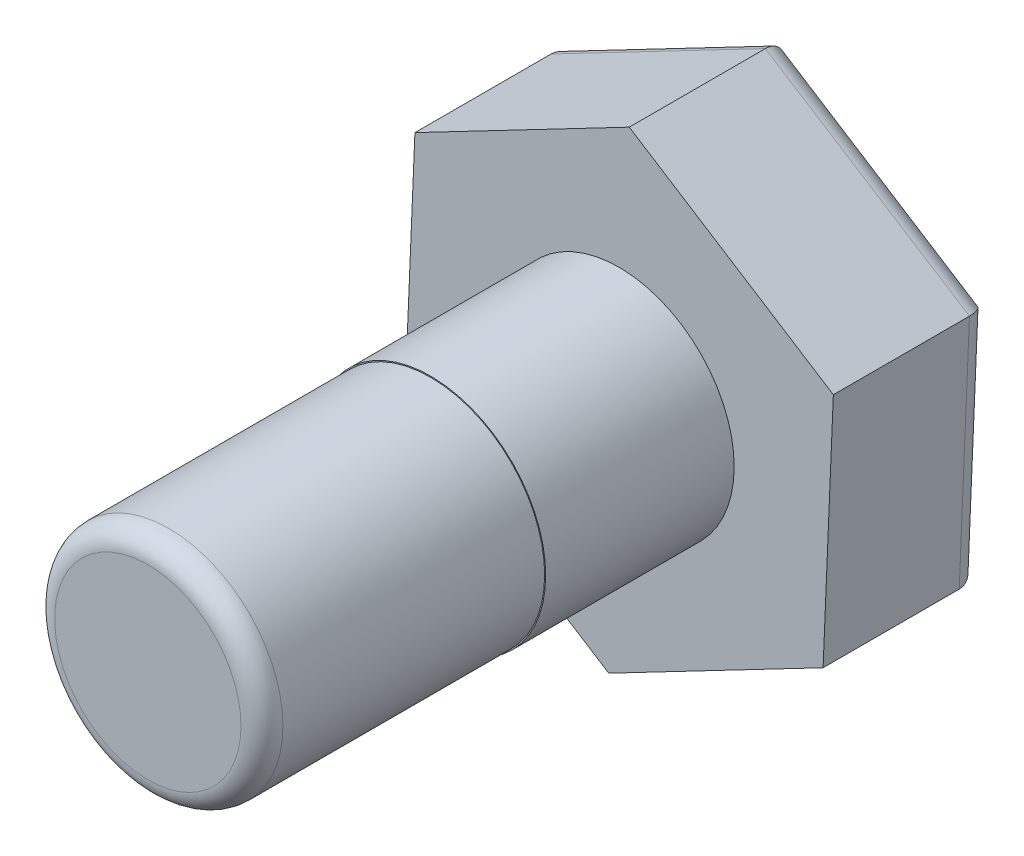
ISO-10303-21;
HEADER;
FILE_DESCRIPTION(('STEP AP214'),'2;1');
FILE_NAME('part.step','',(''),(''),'','','');
FILE_SCHEMA(('AUTOMOTIVE_DESIGN { 1 0 10303 214 1 1 1 1 }'));
ENDSEC;
DATA;
#1=APPLICATION_CONTEXT('core data for automotive mechanical design processes');
#2=APPLICATION_PROTOCOL_DEFINITION('international standard','automotive_design',2000,#1);
#3=PRODUCT_CONTEXT('',#1,'mechanical');
#4=PRODUCT('Part','Part','',(#3));
#5=PRODUCT_RELATED_PRODUCT_CATEGORY('part','',(#4));
#6=PRODUCT_DEFINITION_FORMATION('','',#4);
#7=PRODUCT_DEFINITION_CONTEXT('part definition',#1,'design');
#8=PRODUCT_DEFINITION('design','',#6,#7);
#9=PRODUCT_DEFINITION_SHAPE('','',#8);
#10=(LENGTH_UNIT() NAMED_UNIT(*) SI_UNIT(.MILLI.,.METRE.));
#11=(NAMED_UNIT(*) PLANE_ANGLE_UNIT() SI_UNIT($,.RADIAN.));
#12=(NAMED_UNIT(*) SI_UNIT($,.STERADIAN.) SOLID_ANGLE_UNIT());
#13=UNCERTAINTY_MEASURE_WITH_UNIT(LENGTH_MEASURE(1.E-05),#10,'distance_accuracy_value','');
#14=(GEOMETRIC_REPRESENTATION_CONTEXT(3) GLOBAL_UNCERTAINTY_ASSIGNED_CONTEXT((#13)) GLOBAL_UNIT_ASSIGNED_CONTEXT((#10,
#11,#12)) REPRESENTATION_CONTEXT('',''));
#15=CARTESIAN_POINT('',(0.,0.,0.));
#16=DIRECTION('',(0.,0.,1.));
#17=DIRECTION('',(1.,0.,0.));
#18=AXIS2_PLACEMENT_3D('',#15,#16,#17);
#19=CARTESIAN_POINT('',(0.,0.,33.));
#20=DIRECTION('',(0.,0.,1.));
#21=DIRECTION('',(1.,0.,0.));
#22=AXIS2_PLACEMENT_3D('',#19,#20,#21);
#23=PLANE('',#22);
#24=CARTESIAN_POINT('',(0.,0.,33.));
#25=DIRECTION('',(0.,0.,1.));
#26=DIRECTION('',(1.,0.,0.));
#27=AXIS2_PLACEMENT_3D('',#24,#25,#26);
#28=CIRCLE('',#27,11.);
#29=CARTESIAN_POINT('',(11.,0.,33.));
#30=VERTEX_POINT('',#29);
#31=EDGE_CURVE('E130',#30,#30,#28,.T.);
#32=ORIENTED_EDGE('',*,*,#31,.T.);
#33=EDGE_LOOP('',(#32));
#34=FACE_BOUND('',#33,.T.);
#35=CARTESIAN_POINT('',(0.,0.,33.));
#36=DIRECTION('',(0.,0.,1.));
#37=DIRECTION('',(1.,0.,0.));
#38=AXIS2_PLACEMENT_3D('',#35,#36,#37);
#39=CIRCLE('',#38,10.9);
#40=CARTESIAN_POINT('',(10.9,0.,33.));
#41=VERTEX_POINT('',#40);
#42=EDGE_CURVE('E165',#41,#41,#39,.T.);
#43=ORIENTED_EDGE('',*,*,#42,.F.);
#44=EDGE_LOOP('',(#43));
#45=FACE_BOUND('',#44,.T.);
#46=ADVANCED_FACE('F37',(#34,#45),#23,.T.);
#47=CARTESIAN_POINT('',(19.4915119627059,-12.3860524276714,15.));
#48=DIRECTION('',(-0.999097599975706,0.0424733530908878,0.));
#49=DIRECTION('',(-0.0424733530908878,-0.999097599975706,0.));
#50=AXIS2_PLACEMENT_3D('',#47,#48,#49);
#51=PLANE('',#50);
#52=DIRECTION('',(0.,0.,-1.));
#53=VECTOR('',#52,1.);
#54=CARTESIAN_POINT('',(19.4915119627059,-12.3860524276714,15.));
#55=LINE('',#54,#53);
#56=CARTESIAN_POINT('',(19.4915119627059,-12.3860524276714,15.));
#57=VERTEX_POINT('',#56);
#58=CARTESIAN_POINT('',(19.4915119627059,-12.3860524276714,2.));
#59=VERTEX_POINT('',#58);
#60=EDGE_CURVE('E278',#57,#59,#55,.T.);
#61=ORIENTED_EDGE('',*,*,#60,.T.);
#62=DIRECTION('',(0.0424733530908878,0.999097599975706,0.));
#63=VECTOR('',#62,1.);
#64=CARTESIAN_POINT('',(19.4915119627059,-12.3860524276714,2.));
#65=LINE('',#64,#63);
#66=CARTESIAN_POINT('',(20.4723920363223,10.6871183040359,2.));
#67=VERTEX_POINT('',#66);
#68=EDGE_CURVE('E134',#59,#67,#65,.T.);
#69=ORIENTED_EDGE('',*,*,#68,.T.);
#70=DIRECTION('',(0.,0.,-1.));
#71=VECTOR('',#70,1.);
#72=CARTESIAN_POINT('',(20.4723920363223,10.6871183040359,15.));
#73=LINE('',#72,#71);
#74=CARTESIAN_POINT('',(20.4723920363223,10.6871183040359,15.));
#75=VERTEX_POINT('',#74);
#76=EDGE_CURVE('E116',#75,#67,#73,.T.);
#77=ORIENTED_EDGE('',*,*,#76,.F.);
#78=DIRECTION('',(0.0424733530908878,0.999097599975707,0.));
#79=VECTOR('',#78,1.);
#80=CARTESIAN_POINT('',(19.4915119627059,-12.3860524276714,15.));
#81=LINE('',#80,#79);
#82=EDGE_CURVE('E123',#57,#75,#81,.T.);
#83=ORIENTED_EDGE('',*,*,#82,.F.);
#84=EDGE_LOOP('',(#61,#69,#77,#83));
#85=FACE_BOUND('',#84,.T.);
#86=ADVANCED_FACE('F132',(#85),#51,.F.);
#87=CARTESIAN_POINT('',(20.4723920363223,10.6871183040359,15.));
#88=DIRECTION('',(-0.536331802748468,-0.844007225893581,0.));
#89=DIRECTION('',(0.844007225893581,-0.536331802748468,0.));
#90=AXIS2_PLACEMENT_3D('',#87,#88,#89);
#91=PLANE('',#90);
#92=ORIENTED_EDGE('',*,*,#76,.T.);
#93=DIRECTION('',(-0.844007225893581,0.536331802748468,0.));
#94=VECTOR('',#93,1.);
#95=CARTESIAN_POINT('',(20.4723920363223,10.6871183040359,2.));
#96=LINE('',#95,#94);
#97=CARTESIAN_POINT('',(0.980880073616411,23.0731707317073,2.));
#98=VERTEX_POINT('',#97);
#99=EDGE_CURVE('E135',#67,#98,#96,.T.);
#100=ORIENTED_EDGE('',*,*,#99,.T.);
#101=DIRECTION('',(0.,0.,-1.));
#102=VECTOR('',#101,1.);
#103=CARTESIAN_POINT('',(0.980880073616411,23.0731707317073,15.));
#104=LINE('',#103,#102);
#105=CARTESIAN_POINT('',(0.980880073616411,23.0731707317073,15.));
#106=VERTEX_POINT('',#105);
#107=EDGE_CURVE('E119',#106,#98,#104,.T.);
#108=ORIENTED_EDGE('',*,*,#107,.F.);
#109=DIRECTION('',(-0.844007225893581,0.536331802748468,0.));
#110=VECTOR('',#109,1.);
#111=CARTESIAN_POINT('',(20.4723920363223,10.6871183040359,15.));
#112=LINE('',#111,#110);
#113=EDGE_CURVE('E111',#75,#106,#112,.T.);
#114=ORIENTED_EDGE('',*,*,#113,.F.);
#115=EDGE_LOOP('',(#92,#100,#108,#114));
#116=FACE_BOUND('',#115,.T.);
#117=ADVANCED_FACE('F113',(#116),#91,.F.);
#118=CARTESIAN_POINT('',(0.980880073616411,23.0731707317073,15.));
#119=DIRECTION('',(0.462765797227238,-0.886480578984469,0.));
#120=DIRECTION('',(0.886480578984469,0.462765797227238,0.));
#121=AXIS2_PLACEMENT_3D('',#118,#119,#120);
#122=PLANE('',#121);
#123=ORIENTED_EDGE('',*,*,#107,.T.);
#124=DIRECTION('',(-0.886480578984469,-0.462765797227238,0.));
#125=VECTOR('',#124,1.);
#126=CARTESIAN_POINT('',(0.980880073616411,23.0731707317073,2.));
#127=LINE('',#126,#125);
#128=CARTESIAN_POINT('',(-19.4915119627059,12.3860524276714,2.));
#129=VERTEX_POINT('',#128);
#130=EDGE_CURVE('E155',#98,#129,#127,.T.);
#131=ORIENTED_EDGE('',*,*,#130,.T.);
#132=DIRECTION('',(0.,0.,-1.));
#133=VECTOR('',#132,1.);
#134=CARTESIAN_POINT('',(-19.4915119627059,12.3860524276714,15.));
#135=LINE('',#134,#133);
#136=CARTESIAN_POINT('',(-19.4915119627059,12.3860524276714,15.));
#137=VERTEX_POINT('',#136);
#138=EDGE_CURVE('E139',#137,#129,#135,.T.);
#139=ORIENTED_EDGE('',*,*,#138,.F.);
#140=DIRECTION('',(-0.886480578984469,-0.462765797227238,0.));
#141=VECTOR('',#140,1.);
#142=CARTESIAN_POINT('',(0.980880073616411,23.0731707317073,15.));
#143=LINE('',#142,#141);
#144=EDGE_CURVE('E122',#106,#137,#143,.T.);
#145=ORIENTED_EDGE('',*,*,#144,.F.);
#146=EDGE_LOOP('',(#123,#131,#139,#145));
#147=FACE_BOUND('',#146,.T.);
#148=ADVANCED_FACE('F224',(#147),#122,.F.);
#149=CARTESIAN_POINT('',(-19.4915119627059,12.3860524276714,15.));
#150=DIRECTION('',(0.999097599975706,-0.0424733530908877,0.));
#151=DIRECTION('',(0.0424733530908877,0.999097599975706,0.));
#152=AXIS2_PLACEMENT_3D('',#149,#150,#151);
#153=PLANE('',#152);
#154=ORIENTED_EDGE('',*,*,#138,.T.);
#155=DIRECTION('',(-0.0424733530908877,-0.999097599975706,0.));
#156=VECTOR('',#155,1.);
#157=CARTESIAN_POINT('',(-19.4915119627059,12.3860524276714,2.));
#158=LINE('',#157,#156);
#159=CARTESIAN_POINT('',(-20.4723920363223,-10.6871183040359,2.));
#160=VERTEX_POINT('',#159);
#161=EDGE_CURVE('E157',#129,#160,#158,.T.);
#162=ORIENTED_EDGE('',*,*,#161,.T.);
#163=DIRECTION('',(0.,0.,-1.));
#164=VECTOR('',#163,1.);
#165=CARTESIAN_POINT('',(-20.4723920363223,-10.6871183040359,15.));
#166=LINE('',#165,#164);
#167=CARTESIAN_POINT('',(-20.4723920363223,-10.6871183040359,15.));
#168=VERTEX_POINT('',#167);
#169=EDGE_CURVE('E282',#168,#160,#166,.T.);
#170=ORIENTED_EDGE('',*,*,#169,.F.);
#171=DIRECTION('',(-0.0424733530908877,-0.999097599975707,0.));
#172=VECTOR('',#171,1.);
#173=CARTESIAN_POINT('',(-19.4915119627059,12.3860524276714,15.));
#174=LINE('',#173,#172);
#175=EDGE_CURVE('E271',#137,#168,#174,.T.);
#176=ORIENTED_EDGE('',*,*,#175,.F.);
#177=EDGE_LOOP('',(#154,#162,#170,#176));
#178=FACE_BOUND('',#177,.T.);
#179=ADVANCED_FACE('F221',(#178),#153,.F.);
#180=CARTESIAN_POINT('',(-20.4723920363223,-10.6871183040359,15.));
#181=DIRECTION('',(0.536331802748468,0.844007225893581,0.));
#182=DIRECTION('',(-0.844007225893581,0.536331802748468,0.));
#183=AXIS2_PLACEMENT_3D('',#180,#181,#182);
#184=PLANE('',#183);
#185=ORIENTED_EDGE('',*,*,#169,.T.);
#186=DIRECTION('',(0.844007225893581,-0.536331802748468,0.));
#187=VECTOR('',#186,1.);
#188=CARTESIAN_POINT('',(-20.4723920363223,-10.6871183040359,2.));
#189=LINE('',#188,#187);
#190=CARTESIAN_POINT('',(-0.980880073616402,-23.0731707317073,2.));
#191=VERTEX_POINT('',#190);
#192=EDGE_CURVE('E60',#160,#191,#189,.T.);
#193=ORIENTED_EDGE('',*,*,#192,.T.);
#194=DIRECTION('',(0.,0.,-1.));
#195=VECTOR('',#194,1.);
#196=CARTESIAN_POINT('',(-0.980880073616402,-23.0731707317073,15.));
#197=LINE('',#196,#195);
#198=CARTESIAN_POINT('',(-0.980880073616402,-23.0731707317073,15.));
#199=VERTEX_POINT('',#198);
#200=EDGE_CURVE('E280',#199,#191,#197,.T.);
#201=ORIENTED_EDGE('',*,*,#200,.F.);
#202=DIRECTION('',(0.844007225893581,-0.536331802748469,0.));
#203=VECTOR('',#202,1.);
#204=CARTESIAN_POINT('',(-20.4723920363223,-10.6871183040359,15.));
#205=LINE('',#204,#203);
#206=EDGE_CURVE('E273',#168,#199,#205,.T.);
#207=ORIENTED_EDGE('',*,*,#206,.F.);
#208=EDGE_LOOP('',(#185,#193,#201,#207));
#209=FACE_BOUND('',#208,.T.);
#210=ADVANCED_FACE('F218',(#209),#184,.F.);
#211=CARTESIAN_POINT('',(-0.980880073616402,-23.0731707317073,15.));
#212=DIRECTION('',(-0.462765797227238,0.886480578984469,0.));
#213=DIRECTION('',(-0.886480578984469,-0.462765797227238,0.));
#214=AXIS2_PLACEMENT_3D('',#211,#212,#213);
#215=PLANE('',#214);
#216=ORIENTED_EDGE('',*,*,#200,.T.);
#217=DIRECTION('',(0.886480578984469,0.462765797227238,0.));
#218=VECTOR('',#217,1.);
#219=CARTESIAN_POINT('',(-0.980880073616402,-23.0731707317073,2.));
#220=LINE('',#219,#218);
#221=EDGE_CURVE('E52',#191,#59,#220,.T.);
#222=ORIENTED_EDGE('',*,*,#221,.T.);
#223=ORIENTED_EDGE('',*,*,#60,.F.);
#224=DIRECTION('',(0.886480578984469,0.462765797227238,0.));
#225=VECTOR('',#224,1.);
#226=CARTESIAN_POINT('',(-0.980880073616402,-23.0731707317073,15.));
#227=LINE('',#226,#225);
#228=EDGE_CURVE('E128',#199,#57,#227,.T.);
#229=ORIENTED_EDGE('',*,*,#228,.F.);
#230=EDGE_LOOP('',(#216,#222,#223,#229));
#231=FACE_BOUND('',#230,.T.);
#232=ADVANCED_FACE('F211',(#231),#215,.F.);
#233=CARTESIAN_POINT('',(21.4532721099387,33.7602890357432,15.));
#234=DIRECTION('',(0.,0.,1.));
#235=DIRECTION('',(1.,0.,0.));
#236=AXIS2_PLACEMENT_3D('',#233,#234,#235);
#237=PLANE('',#236);
#238=CARTESIAN_POINT('',(0.,0.,15.));
#239=DIRECTION('',(0.,0.,1.));
#240=DIRECTION('',(1.,0.,0.));
#241=AXIS2_PLACEMENT_3D('',#238,#239,#240);
#242=CIRCLE('',#241,11.);
#243=CARTESIAN_POINT('',(11.,0.,15.));
#244=VERTEX_POINT('',#243);
#245=EDGE_CURVE('E178',#244,#244,#242,.T.);
#246=ORIENTED_EDGE('',*,*,#245,.F.);
#247=EDGE_LOOP('',(#246));
#248=FACE_BOUND('',#247,.T.);
#249=ORIENTED_EDGE('',*,*,#82,.T.);
#250=ORIENTED_EDGE('',*,*,#113,.T.);
#251=ORIENTED_EDGE('',*,*,#144,.T.);
#252=ORIENTED_EDGE('',*,*,#175,.T.);
#253=ORIENTED_EDGE('',*,*,#206,.T.);
#254=ORIENTED_EDGE('',*,*,#228,.T.);
#255=EDGE_LOOP('',(#249,#250,#251,#252,#253,#254));
#256=FACE_BOUND('',#255,.T.);
#257=ADVANCED_FACE('F126',(#248,#256),#237,.T.);
#258=CARTESIAN_POINT('',(21.4532721099387,33.7602890357432,0.));
#259=DIRECTION('',(0.,0.,1.));
#260=DIRECTION('',(1.,0.,0.));
#261=AXIS2_PLACEMENT_3D('',#258,#259,#260);
#262=PLANE('',#261);
#263=DIRECTION('',(-0.886480578984469,-0.462765797227238,0.));
#264=VECTOR('',#263,1.);
#265=CARTESIAN_POINT('',(22.3788037043932,31.9873278777743,0.));
#266=LINE('',#265,#264);
#267=CARTESIAN_POINT('',(-17.5423607664353,11.1474471849043,0.));
#268=VERTEX_POINT('',#267);
#269=CARTESIAN_POINT('',(0.882792066254768,20.7658536585366,0.));
#270=VERTEX_POINT('',#269);
#271=EDGE_CURVE('E150',#268,#270,#266,.F.);
#272=ORIENTED_EDGE('',*,*,#271,.T.);
#273=DIRECTION('',(-0.844007225893581,0.536331802748468,0.));
#274=VECTOR('',#273,1.);
#275=CARTESIAN_POINT('',(9.65397244947244,15.1921300660844,0.));
#276=LINE('',#275,#274);
#277=CARTESIAN_POINT('',(18.4251528326901,9.61840647363232,0.));
#278=VERTEX_POINT('',#277);
#279=EDGE_CURVE('E152',#270,#278,#276,.F.);
#280=ORIENTED_EDGE('',*,*,#279,.T.);
#281=DIRECTION('',(0.0424733530908878,0.999097599975706,0.));
#282=VECTOR('',#281,1.);
#283=CARTESIAN_POINT('',(19.4550769099873,33.845235741925,0.));
#284=LINE('',#283,#282);
#285=CARTESIAN_POINT('',(17.5423607664353,-11.1474471849043,0.));
#286=VERTEX_POINT('',#285);
#287=EDGE_CURVE('E137',#278,#286,#284,.F.);
#288=ORIENTED_EDGE('',*,*,#287,.T.);
#289=DIRECTION('',(0.886480578984469,0.462765797227238,0.));
#290=VECTOR('',#289,1.);
#291=CARTESIAN_POINT('',(39.0383724045738,0.0740270343334015,0.));
#292=LINE('',#291,#290);
#293=CARTESIAN_POINT('',(-0.882792066254761,-20.7658536585366,0.));
#294=VERTEX_POINT('',#293);
#295=EDGE_CURVE('E144',#286,#294,#292,.F.);
#296=ORIENTED_EDGE('',*,*,#295,.T.);
#297=DIRECTION('',(0.844007225893581,-0.536331802748468,0.));
#298=VECTOR('',#297,1.);
#299=CARTESIAN_POINT('',(-9.65397244947243,-15.1921300660844,0.));
#300=LINE('',#299,#298);
#301=CARTESIAN_POINT('',(-18.4251528326901,-9.61840647363232,0.));
#302=VERTEX_POINT('',#301);
#303=EDGE_CURVE('E146',#294,#302,#300,.F.);
#304=ORIENTED_EDGE('',*,*,#303,.T.);
#305=DIRECTION('',(-0.0424733530908877,-0.999097599975706,0.));
#306=VECTOR('',#305,1.);
#307=CARTESIAN_POINT('',(-16.5124366891381,35.374276453197,0.));
#308=LINE('',#307,#306);
#309=EDGE_CURVE('E148',#302,#268,#308,.F.);
#310=ORIENTED_EDGE('',*,*,#309,.T.);
#311=EDGE_LOOP('',(#272,#280,#288,#296,#304,#310));
#312=FACE_BOUND('',#311,.T.);
#313=ADVANCED_FACE('F207',(#312),#262,.F.);
#314=CARTESIAN_POINT('',(0.,0.,33.));
#315=DIRECTION('',(0.,0.,-1.));
#316=DIRECTION('',(-1.,0.,0.));
#317=AXIS2_PLACEMENT_3D('',#314,#315,#316);
#318=CYLINDRICAL_SURFACE('',#317,11.);
#319=ORIENTED_EDGE('',*,*,#31,.F.);
#320=EDGE_LOOP('',(#319));
#321=FACE_BOUND('',#320,.T.);
#322=ORIENTED_EDGE('',*,*,#245,.T.);
#323=EDGE_LOOP('',(#322));
#324=FACE_BOUND('',#323,.T.);
#325=ADVANCED_FACE('F203',(#321,#324),#318,.T.);
#326=CARTESIAN_POINT('',(-19.3997284308254,-8.99910385224874,2.));
#327=DIRECTION('',(0.844007225893581,-0.536331802748468,0.));
#328=DIRECTION('',(0.536331802748468,0.844007225893581,0.));
#329=AXIS2_PLACEMENT_3D('',#326,#327,#328);
#330=CYLINDRICAL_SURFACE('',#329,2.);
#331=CARTESIAN_POINT('',(-18.4251528326901,-9.61840647363232,2.));
#332=DIRECTION('',(0.462765797227238,-0.886480578984469,0.));
#333=DIRECTION('',(0.886480578984469,0.462765797227238,0.));
#334=AXIS2_PLACEMENT_3D('',#331,#332,#333);
#335=ELLIPSE('',#334,2.3094010767585,2.);
#336=EDGE_CURVE('E173',#302,#160,#335,.F.);
#337=ORIENTED_EDGE('',*,*,#336,.F.);
#338=ORIENTED_EDGE('',*,*,#303,.F.);
#339=CARTESIAN_POINT('',(-0.882792066254761,-20.7658536585366,2.));
#340=DIRECTION('',(0.999097599975706,-0.042473353090888,0.));
#341=DIRECTION('',(0.042473353090888,0.999097599975707,0.));
#342=AXIS2_PLACEMENT_3D('',#339,#340,#341);
#343=ELLIPSE('',#342,2.3094010767585,2.);
#344=EDGE_CURVE('E176',#191,#294,#343,.T.);
#345=ORIENTED_EDGE('',*,*,#344,.F.);
#346=ORIENTED_EDGE('',*,*,#192,.F.);
#347=EDGE_LOOP('',(#337,#338,#345,#346));
#348=FACE_BOUND('',#347,.T.);
#349=ADVANCED_FACE('F206',(#348),#330,.T.);
#350=CARTESIAN_POINT('',(-1.90641166807088,-21.3002095737384,2.));
#351=DIRECTION('',(0.886480578984469,0.462765797227238,0.));
#352=DIRECTION('',(-0.462765797227238,0.886480578984469,0.));
#353=AXIS2_PLACEMENT_3D('',#350,#351,#352);
#354=CYLINDRICAL_SURFACE('',#353,2.);
#355=ORIENTED_EDGE('',*,*,#344,.T.);
#356=ORIENTED_EDGE('',*,*,#295,.F.);
#357=CARTESIAN_POINT('',(17.5423607664353,-11.1474471849043,2.));
#358=DIRECTION('',(0.536331802748468,0.844007225893581,0.));
#359=DIRECTION('',(-0.844007225893581,0.536331802748469,0.));
#360=AXIS2_PLACEMENT_3D('',#357,#358,#359);
#361=ELLIPSE('',#360,2.3094010767585,2.);
#362=EDGE_CURVE('E170',#59,#286,#361,.T.);
#363=ORIENTED_EDGE('',*,*,#362,.F.);
#364=ORIENTED_EDGE('',*,*,#221,.F.);
#365=EDGE_LOOP('',(#355,#356,#363,#364));
#366=FACE_BOUND('',#365,.T.);
#367=ADVANCED_FACE('F246',(#366),#354,.T.);
#368=CARTESIAN_POINT('',(-17.4933167627545,12.3011057214896,2.));
#369=DIRECTION('',(-0.0424733530908877,-0.999097599975706,0.));
#370=DIRECTION('',(0.999097599975706,-0.0424733530908877,0.));
#371=AXIS2_PLACEMENT_3D('',#368,#369,#370);
#372=CYLINDRICAL_SURFACE('',#371,2.);
#373=ORIENTED_EDGE('',*,*,#336,.T.);
#374=ORIENTED_EDGE('',*,*,#161,.F.);
#375=CARTESIAN_POINT('',(-17.5423607664353,11.1474471849043,2.));
#376=DIRECTION('',(-0.536331802748468,-0.844007225893581,0.));
#377=DIRECTION('',(0.844007225893581,-0.536331802748468,0.));
#378=AXIS2_PLACEMENT_3D('',#375,#376,#377);
#379=ELLIPSE('',#378,2.3094010767585,2.);
#380=EDGE_CURVE('E167',#268,#129,#379,.F.);
#381=ORIENTED_EDGE('',*,*,#380,.F.);
#382=ORIENTED_EDGE('',*,*,#309,.F.);
#383=EDGE_LOOP('',(#373,#374,#381,#382));
#384=FACE_BOUND('',#383,.T.);
#385=ADVANCED_FACE('F242',(#384),#372,.T.);
#386=CARTESIAN_POINT('',(17.4933167627545,-12.3011057214897,2.));
#387=DIRECTION('',(0.0424733530908878,0.999097599975706,0.));
#388=DIRECTION('',(-0.999097599975706,0.0424733530908878,0.));
#389=AXIS2_PLACEMENT_3D('',#386,#387,#388);
#390=CYLINDRICAL_SURFACE('',#389,2.);
#391=ORIENTED_EDGE('',*,*,#362,.T.);
#392=ORIENTED_EDGE('',*,*,#287,.F.);
#393=CARTESIAN_POINT('',(18.4251528326901,9.61840647363231,2.));
#394=DIRECTION('',(-0.462765797227238,0.886480578984469,0.));
#395=DIRECTION('',(0.886480578984469,0.462765797227238,0.));
#396=AXIS2_PLACEMENT_3D('',#393,#394,#395);
#397=ELLIPSE('',#396,2.3094010767585,2.);
#398=EDGE_CURVE('E164',#67,#278,#397,.T.);
#399=ORIENTED_EDGE('',*,*,#398,.F.);
#400=ORIENTED_EDGE('',*,*,#68,.F.);
#401=EDGE_LOOP('',(#391,#392,#399,#400));
#402=FACE_BOUND('',#401,.T.);
#403=ADVANCED_FACE('F238',(#402),#390,.T.);
#404=CARTESIAN_POINT('',(1.90641166807089,21.3002095737384,2.));
#405=DIRECTION('',(-0.886480578984469,-0.462765797227238,0.));
#406=DIRECTION('',(0.462765797227238,-0.886480578984469,0.));
#407=AXIS2_PLACEMENT_3D('',#404,#405,#406);
#408=CYLINDRICAL_SURFACE('',#407,2.);
#409=ORIENTED_EDGE('',*,*,#380,.T.);
#410=ORIENTED_EDGE('',*,*,#130,.F.);
#411=CARTESIAN_POINT('',(0.882792066254761,20.7658536585366,2.));
#412=DIRECTION('',(-0.999097599975706,0.042473353090888,0.));
#413=DIRECTION('',(-0.0424733530908879,-0.999097599975706,0.));
#414=AXIS2_PLACEMENT_3D('',#411,#412,#413);
#415=ELLIPSE('',#414,2.3094010767585,2.);
#416=EDGE_CURVE('E162',#270,#98,#415,.F.);
#417=ORIENTED_EDGE('',*,*,#416,.F.);
#418=ORIENTED_EDGE('',*,*,#271,.F.);
#419=EDGE_LOOP('',(#409,#410,#417,#418));
#420=FACE_BOUND('',#419,.T.);
#421=ADVANCED_FACE('F234',(#420),#408,.T.);
#422=CARTESIAN_POINT('',(19.3997284308254,8.99910385224875,2.));
#423=DIRECTION('',(-0.844007225893581,0.536331802748468,0.));
#424=DIRECTION('',(-0.536331802748468,-0.844007225893581,0.));
#425=AXIS2_PLACEMENT_3D('',#422,#423,#424);
#426=CYLINDRICAL_SURFACE('',#425,2.);
#427=ORIENTED_EDGE('',*,*,#398,.T.);
#428=ORIENTED_EDGE('',*,*,#279,.F.);
#429=ORIENTED_EDGE('',*,*,#416,.T.);
#430=ORIENTED_EDGE('',*,*,#99,.F.);
#431=EDGE_LOOP('',(#427,#428,#429,#430));
#432=FACE_BOUND('',#431,.T.);
#433=ADVANCED_FACE('F231',(#432),#426,.T.);
#434=CARTESIAN_POINT('',(0.,0.,60.));
#435=DIRECTION('',(0.,0.,-1.));
#436=DIRECTION('',(-1.,0.,0.));
#437=AXIS2_PLACEMENT_3D('',#434,#435,#436);
#438=CYLINDRICAL_SURFACE('',#437,10.9);
#439=CARTESIAN_POINT('',(0.,0.,58.));
#440=DIRECTION('',(0.,0.,1.));
#441=DIRECTION('',(1.,0.,0.));
#442=AXIS2_PLACEMENT_3D('',#439,#440,#441);
#443=CIRCLE('',#442,10.9);
#444=CARTESIAN_POINT('',(10.9,0.,58.));
#445=VERTEX_POINT('',#444);
#446=EDGE_CURVE('E11',#445,#445,#443,.F.);
#447=ORIENTED_EDGE('',*,*,#446,.T.);
#448=EDGE_LOOP('',(#447));
#449=FACE_BOUND('',#448,.T.);
#450=ORIENTED_EDGE('',*,*,#42,.T.);
#451=EDGE_LOOP('',(#450));
#452=FACE_BOUND('',#451,.T.);
#453=ADVANCED_FACE('F189',(#449,#452),#438,.T.);
#454=CARTESIAN_POINT('',(0.,0.,60.));
#455=DIRECTION('',(0.,0.,1.));
#456=DIRECTION('',(1.,0.,0.));
#457=AXIS2_PLACEMENT_3D('',#454,#455,#456);
#458=PLANE('',#457);
#459=CARTESIAN_POINT('',(0.,0.,60.));
#460=DIRECTION('',(0.,0.,1.));
#461=DIRECTION('',(1.,0.,0.));
#462=AXIS2_PLACEMENT_3D('',#459,#460,#461);
#463=CIRCLE('',#462,8.9);
#464=CARTESIAN_POINT('',(8.9,0.,60.));
#465=VERTEX_POINT('',#464);
#466=EDGE_CURVE('E45',#465,#465,#463,.T.);
#467=ORIENTED_EDGE('',*,*,#466,.T.);
#468=EDGE_LOOP('',(#467));
#469=FACE_BOUND('',#468,.T.);
#470=ADVANCED_FACE('F182',(#469),#458,.T.);
#471=CARTESIAN_POINT('',(0.,0.,58.));
#472=DIRECTION('',(0.,0.,1.));
#473=DIRECTION('',(1.,0.,0.));
#474=AXIS2_PLACEMENT_3D('',#471,#472,#473);
#475=TOROIDAL_SURFACE('',#474,8.9,2.);
#476=ORIENTED_EDGE('',*,*,#446,.F.);
#477=EDGE_LOOP('',(#476));
#478=FACE_BOUND('',#477,.T.);
#479=ORIENTED_EDGE('',*,*,#466,.F.);
#480=EDGE_LOOP('',(#479));
#481=FACE_BOUND('',#480,.T.);
#482=ADVANCED_FACE('F39',(#478,#481),#475,.T.);
#483=CLOSED_SHELL('',(#46,#86,#117,#148,#179,#210,#232,#257,#313,#325,#349,#367,#385,#403,#421,
#433,#453,#470,#482));
#484=MANIFOLD_SOLID_BREP('B2',#483);
#485=ADVANCED_BREP_SHAPE_REPRESENTATION('',(#18,#484),#14);
#486=SHAPE_DEFINITION_REPRESENTATION(#9,#485);
ENDSEC;
END-ISO-10303-21;
